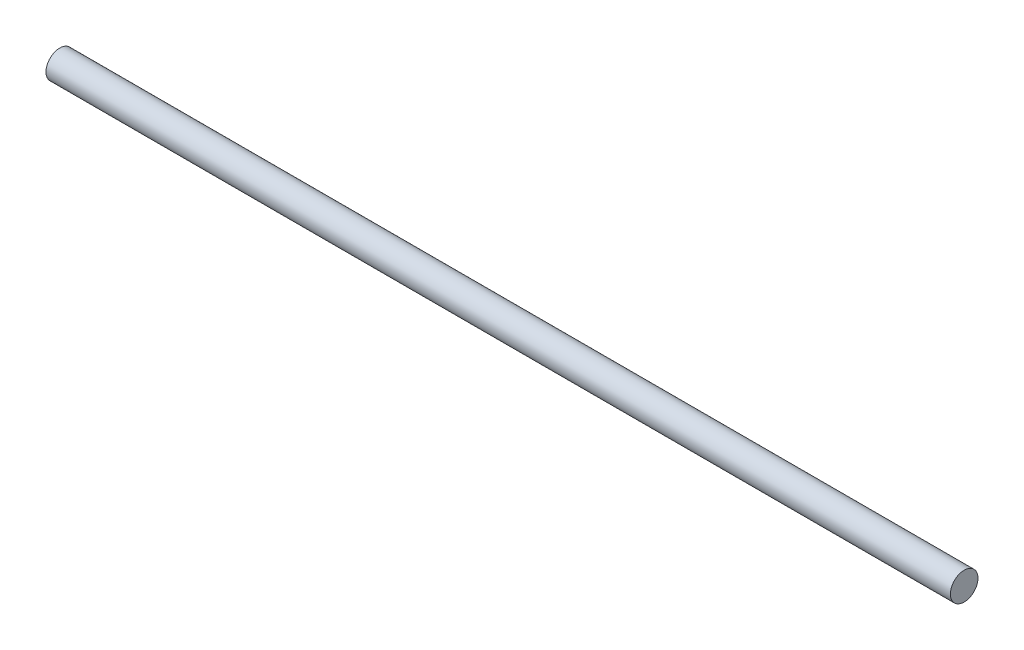
ISO-10303-21;
HEADER;
FILE_DESCRIPTION(('STEP AP214'),'2;1');
FILE_NAME('part.step','',(''),(''),'','','');
FILE_SCHEMA(('AUTOMOTIVE_DESIGN { 1 0 10303 214 1 1 1 1 }'));
ENDSEC;
DATA;
#1=APPLICATION_CONTEXT('core data for automotive mechanical design processes');
#2=APPLICATION_PROTOCOL_DEFINITION('international standard','automotive_design',2000,#1);
#3=PRODUCT_CONTEXT('',#1,'mechanical');
#4=PRODUCT('Part','Part','',(#3));
#5=PRODUCT_RELATED_PRODUCT_CATEGORY('part','',(#4));
#6=PRODUCT_DEFINITION_FORMATION('','',#4);
#7=PRODUCT_DEFINITION_CONTEXT('part definition',#1,'design');
#8=PRODUCT_DEFINITION('design','',#6,#7);
#9=PRODUCT_DEFINITION_SHAPE('','',#8);
#10=(LENGTH_UNIT() NAMED_UNIT(*) SI_UNIT(.MILLI.,.METRE.));
#11=(NAMED_UNIT(*) PLANE_ANGLE_UNIT() SI_UNIT($,.RADIAN.));
#12=(NAMED_UNIT(*) SI_UNIT($,.STERADIAN.) SOLID_ANGLE_UNIT());
#13=UNCERTAINTY_MEASURE_WITH_UNIT(LENGTH_MEASURE(1.E-05),#10,'distance_accuracy_value','');
#14=(GEOMETRIC_REPRESENTATION_CONTEXT(3) GLOBAL_UNCERTAINTY_ASSIGNED_CONTEXT((#13)) GLOBAL_UNIT_ASSIGNED_CONTEXT((#10,
#11,#12)) REPRESENTATION_CONTEXT('',''));
#15=CARTESIAN_POINT('',(0.,0.,0.));
#16=DIRECTION('',(0.,0.,1.));
#17=DIRECTION('',(1.,0.,0.));
#18=AXIS2_PLACEMENT_3D('',#15,#16,#17);
#19=CARTESIAN_POINT('',(104.775,0.,0.));
#20=DIRECTION('',(-1.,0.,0.));
#21=DIRECTION('',(0.,0.,1.));
#22=AXIS2_PLACEMENT_3D('',#19,#20,#21);
#23=CYLINDRICAL_SURFACE('',#22,1.6);
#24=CARTESIAN_POINT('',(104.775,0.,0.));
#25=DIRECTION('',(1.,0.,0.));
#26=DIRECTION('',(0.,0.,-1.));
#27=AXIS2_PLACEMENT_3D('',#24,#25,#26);
#28=CIRCLE('',#27,1.6);
#29=CARTESIAN_POINT('',(104.775,0.,-1.6));
#30=VERTEX_POINT('',#29);
#31=EDGE_CURVE('E10',#30,#30,#28,.T.);
#32=ORIENTED_EDGE('',*,*,#31,.F.);
#33=EDGE_LOOP('',(#32));
#34=FACE_BOUND('',#33,.T.);
#35=CARTESIAN_POINT('',(0.,0.,0.));
#36=DIRECTION('',(1.,0.,0.));
#37=DIRECTION('',(0.,0.,-1.));
#38=AXIS2_PLACEMENT_3D('',#35,#36,#37);
#39=CIRCLE('',#38,1.6);
#40=CARTESIAN_POINT('',(0.,0.,-1.6));
#41=VERTEX_POINT('',#40);
#42=EDGE_CURVE('E33',#41,#41,#39,.T.);
#43=ORIENTED_EDGE('',*,*,#42,.T.);
#44=EDGE_LOOP('',(#43));
#45=FACE_BOUND('',#44,.T.);
#46=ADVANCED_FACE('F30',(#34,#45),#23,.T.);
#47=CARTESIAN_POINT('',(104.775,0.,0.));
#48=DIRECTION('',(1.,0.,0.));
#49=DIRECTION('',(0.,0.,-1.));
#50=AXIS2_PLACEMENT_3D('',#47,#48,#49);
#51=PLANE('',#50);
#52=ORIENTED_EDGE('',*,*,#31,.T.);
#53=EDGE_LOOP('',(#52));
#54=FACE_BOUND('',#53,.T.);
#55=ADVANCED_FACE('F45',(#54),#51,.T.);
#56=CARTESIAN_POINT('',(0.,0.,0.));
#57=DIRECTION('',(1.,0.,0.));
#58=DIRECTION('',(0.,0.,-1.));
#59=AXIS2_PLACEMENT_3D('',#56,#57,#58);
#60=PLANE('',#59);
#61=ORIENTED_EDGE('',*,*,#42,.F.);
#62=EDGE_LOOP('',(#61));
#63=FACE_BOUND('',#62,.T.);
#64=ADVANCED_FACE('F43',(#63),#60,.F.);
#65=CLOSED_SHELL('',(#46,#55,#64));
#66=MANIFOLD_SOLID_BREP('B2',#65);
#67=ADVANCED_BREP_SHAPE_REPRESENTATION('',(#18,#66),#14);
#68=SHAPE_DEFINITION_REPRESENTATION(#9,#67);
ENDSEC;
END-ISO-10303-21;
